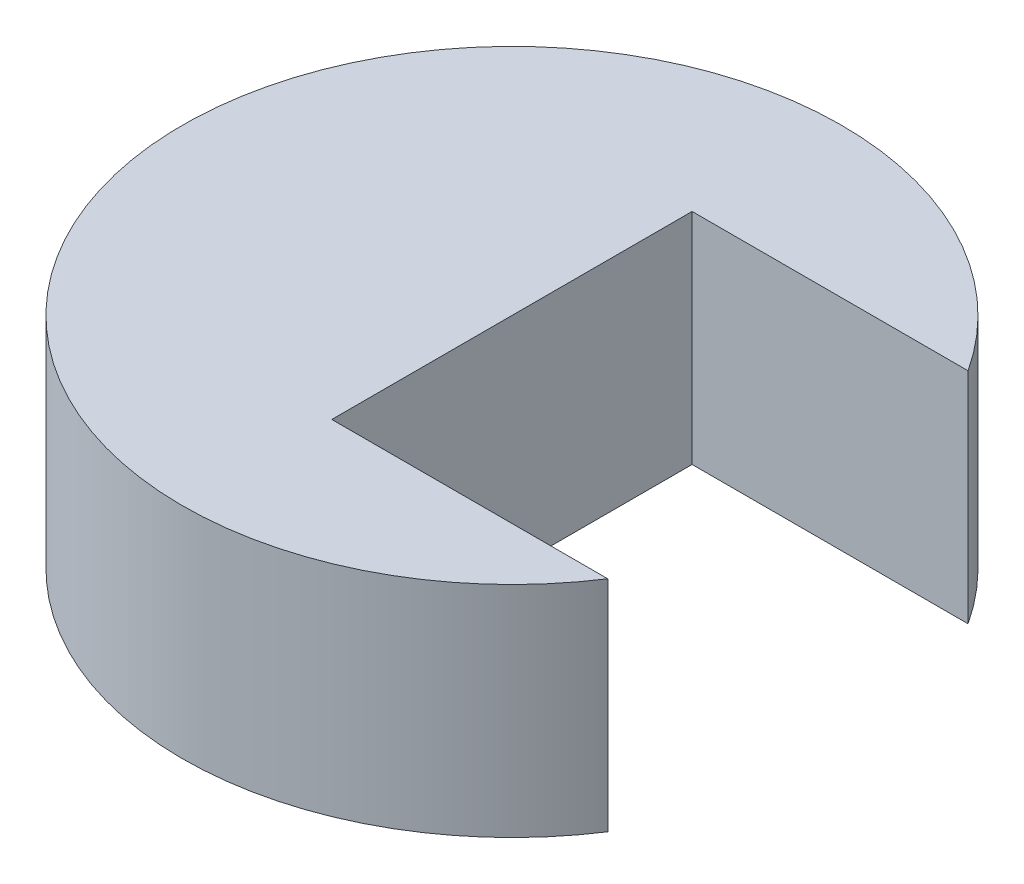
ISO-10303-21;
HEADER;
FILE_DESCRIPTION(('STEP AP214'),'2;1');
FILE_NAME('part.step','',(''),(''),'','','');
FILE_SCHEMA(('AUTOMOTIVE_DESIGN { 1 0 10303 214 1 1 1 1 }'));
ENDSEC;
DATA;
#1=APPLICATION_CONTEXT('core data for automotive mechanical design processes');
#2=APPLICATION_PROTOCOL_DEFINITION('international standard','automotive_design',2000,#1);
#3=PRODUCT_CONTEXT('',#1,'mechanical');
#4=PRODUCT('Part','Part','',(#3));
#5=PRODUCT_RELATED_PRODUCT_CATEGORY('part','',(#4));
#6=PRODUCT_DEFINITION_FORMATION('','',#4);
#7=PRODUCT_DEFINITION_CONTEXT('part definition',#1,'design');
#8=PRODUCT_DEFINITION('design','',#6,#7);
#9=PRODUCT_DEFINITION_SHAPE('','',#8);
#10=(LENGTH_UNIT() NAMED_UNIT(*) SI_UNIT(.MILLI.,.METRE.));
#11=(NAMED_UNIT(*) PLANE_ANGLE_UNIT() SI_UNIT($,.RADIAN.));
#12=(NAMED_UNIT(*) SI_UNIT($,.STERADIAN.) SOLID_ANGLE_UNIT());
#13=UNCERTAINTY_MEASURE_WITH_UNIT(LENGTH_MEASURE(1.E-05),#10,'distance_accuracy_value','');
#14=(GEOMETRIC_REPRESENTATION_CONTEXT(3) GLOBAL_UNCERTAINTY_ASSIGNED_CONTEXT((#13)) GLOBAL_UNIT_ASSIGNED_CONTEXT((#10,
#11,#12)) REPRESENTATION_CONTEXT('',''));
#15=CARTESIAN_POINT('',(0.,0.,0.));
#16=DIRECTION('',(0.,0.,1.));
#17=DIRECTION('',(1.,0.,0.));
#18=AXIS2_PLACEMENT_3D('',#15,#16,#17);
#19=CARTESIAN_POINT('',(0.,20.,-32.8817054401106));
#20=DIRECTION('',(0.,0.,-1.));
#21=DIRECTION('',(-1.,0.,0.));
#22=AXIS2_PLACEMENT_3D('',#19,#20,#21);
#23=PLANE('',#22);
#24=DIRECTION('',(1.,0.,0.));
#25=VECTOR('',#24,1.);
#26=CARTESIAN_POINT('',(0.,0.,-32.8817054401106));
#27=LINE('',#26,#25);
#28=CARTESIAN_POINT('',(-21.0523114098269,0.,-32.8817054401106));
#29=VERTEX_POINT('',#28);
#30=CARTESIAN_POINT('',(4.13077381867271,0.,-32.8817054401106));
#31=VERTEX_POINT('',#30);
#32=EDGE_CURVE('E112',#29,#31,#27,.T.);
#33=ORIENTED_EDGE('',*,*,#32,.T.);
#34=DIRECTION('',(0.,-1.,0.));
#35=VECTOR('',#34,1.);
#36=CARTESIAN_POINT('',(4.13077381867271,20.,-32.8817054401106));
#37=LINE('',#36,#35);
#38=CARTESIAN_POINT('',(4.13077381867271,20.,-32.8817054401106));
#39=VERTEX_POINT('',#38);
#40=EDGE_CURVE('E11',#39,#31,#37,.T.);
#41=ORIENTED_EDGE('',*,*,#40,.F.);
#42=DIRECTION('',(1.,0.,0.));
#43=VECTOR('',#42,1.);
#44=CARTESIAN_POINT('',(0.,20.,-32.8817054401106));
#45=LINE('',#44,#43);
#46=CARTESIAN_POINT('',(-21.0523114098269,20.,-32.8817054401106));
#47=VERTEX_POINT('',#46);
#48=EDGE_CURVE('E93',#47,#39,#45,.T.);
#49=ORIENTED_EDGE('',*,*,#48,.F.);
#50=DIRECTION('',(0.,-1.,0.));
#51=VECTOR('',#50,1.);
#52=CARTESIAN_POINT('',(-21.0523114098269,20.,-32.8817054401106));
#53=LINE('',#52,#51);
#54=EDGE_CURVE('E108',#47,#29,#53,.T.);
#55=ORIENTED_EDGE('',*,*,#54,.T.);
#56=EDGE_LOOP('',(#33,#41,#49,#55));
#57=FACE_BOUND('',#56,.T.);
#58=ADVANCED_FACE('F45',(#57),#23,.F.);
#59=CARTESIAN_POINT('',(-21.0523114098269,20.,-16.4408527200553));
#60=DIRECTION('',(0.,-1.,0.));
#61=DIRECTION('',(0.,0.,-1.));
#62=AXIS2_PLACEMENT_3D('',#59,#60,#61);
#63=CYLINDRICAL_SURFACE('',#62,30.074730585467);
#64=CARTESIAN_POINT('',(-21.0523114098269,0.,-16.4408527200553));
#65=DIRECTION('',(0.,1.,0.));
#66=DIRECTION('',(0.,0.,1.));
#67=AXIS2_PLACEMENT_3D('',#64,#65,#66);
#68=CIRCLE('',#67,30.074730585467);
#69=CARTESIAN_POINT('',(4.13077381867271,0.,0.));
#70=VERTEX_POINT('',#69);
#71=EDGE_CURVE('E99',#31,#70,#68,.T.);
#72=ORIENTED_EDGE('',*,*,#71,.T.);
#73=DIRECTION('',(0.,-1.,0.));
#74=VECTOR('',#73,1.);
#75=CARTESIAN_POINT('',(4.13077381867271,20.,0.));
#76=LINE('',#75,#74);
#77=CARTESIAN_POINT('',(4.13077381867271,20.,0.));
#78=VERTEX_POINT('',#77);
#79=EDGE_CURVE('E54',#78,#70,#76,.T.);
#80=ORIENTED_EDGE('',*,*,#79,.F.);
#81=CARTESIAN_POINT('',(-21.0523114098269,20.,-16.4408527200553));
#82=DIRECTION('',(0.,1.,0.));
#83=DIRECTION('',(0.,0.,1.));
#84=AXIS2_PLACEMENT_3D('',#81,#82,#83);
#85=CIRCLE('',#84,30.074730585467);
#86=EDGE_CURVE('E88',#39,#78,#85,.T.);
#87=ORIENTED_EDGE('',*,*,#86,.F.);
#88=ORIENTED_EDGE('',*,*,#40,.T.);
#89=EDGE_LOOP('',(#72,#80,#87,#88));
#90=FACE_BOUND('',#89,.T.);
#91=ADVANCED_FACE('F98',(#90),#63,.T.);
#92=CARTESIAN_POINT('',(0.,20.,0.));
#93=DIRECTION('',(0.,0.,-1.));
#94=DIRECTION('',(-1.,0.,0.));
#95=AXIS2_PLACEMENT_3D('',#92,#93,#94);
#96=PLANE('',#95);
#97=DIRECTION('',(1.,0.,0.));
#98=VECTOR('',#97,1.);
#99=CARTESIAN_POINT('',(0.,0.,0.));
#100=LINE('',#99,#98);
#101=CARTESIAN_POINT('',(-21.0523114098269,0.,0.));
#102=VERTEX_POINT('',#101);
#103=EDGE_CURVE('E118',#102,#70,#100,.T.);
#104=ORIENTED_EDGE('',*,*,#103,.F.);
#105=DIRECTION('',(0.,-1.,0.));
#106=VECTOR('',#105,1.);
#107=CARTESIAN_POINT('',(-21.0523114098269,20.,0.));
#108=LINE('',#107,#106);
#109=CARTESIAN_POINT('',(-21.0523114098269,20.,0.));
#110=VERTEX_POINT('',#109);
#111=EDGE_CURVE('E78',#110,#102,#108,.T.);
#112=ORIENTED_EDGE('',*,*,#111,.F.);
#113=DIRECTION('',(1.,0.,0.));
#114=VECTOR('',#113,1.);
#115=CARTESIAN_POINT('',(0.,20.,0.));
#116=LINE('',#115,#114);
#117=EDGE_CURVE('E91',#110,#78,#116,.T.);
#118=ORIENTED_EDGE('',*,*,#117,.T.);
#119=ORIENTED_EDGE('',*,*,#79,.T.);
#120=EDGE_LOOP('',(#104,#112,#118,#119));
#121=FACE_BOUND('',#120,.T.);
#122=ADVANCED_FACE('F104',(#121),#96,.T.);
#123=CARTESIAN_POINT('',(-21.0523114098269,20.,0.));
#124=DIRECTION('',(-1.,0.,0.));
#125=DIRECTION('',(0.,0.,1.));
#126=AXIS2_PLACEMENT_3D('',#123,#124,#125);
#127=PLANE('',#126);
#128=DIRECTION('',(0.,0.,-1.));
#129=VECTOR('',#128,1.);
#130=CARTESIAN_POINT('',(-21.0523114098269,0.,0.));
#131=LINE('',#130,#129);
#132=EDGE_CURVE('E81',#102,#29,#131,.T.);
#133=ORIENTED_EDGE('',*,*,#132,.T.);
#134=ORIENTED_EDGE('',*,*,#54,.F.);
#135=DIRECTION('',(0.,0.,-1.));
#136=VECTOR('',#135,1.);
#137=CARTESIAN_POINT('',(-21.0523114098269,20.,0.));
#138=LINE('',#137,#136);
#139=EDGE_CURVE('E62',#110,#47,#138,.T.);
#140=ORIENTED_EDGE('',*,*,#139,.F.);
#141=ORIENTED_EDGE('',*,*,#111,.T.);
#142=EDGE_LOOP('',(#133,#134,#140,#141));
#143=FACE_BOUND('',#142,.T.);
#144=ADVANCED_FACE('F135',(#143),#127,.F.);
#145=CARTESIAN_POINT('',(0.,20.,0.));
#146=DIRECTION('',(0.,1.,0.));
#147=DIRECTION('',(0.,0.,1.));
#148=AXIS2_PLACEMENT_3D('',#145,#146,#147);
#149=PLANE('',#148);
#150=ORIENTED_EDGE('',*,*,#48,.T.);
#151=ORIENTED_EDGE('',*,*,#86,.T.);
#152=ORIENTED_EDGE('',*,*,#117,.F.);
#153=ORIENTED_EDGE('',*,*,#139,.T.);
#154=EDGE_LOOP('',(#150,#151,#152,#153));
#155=FACE_BOUND('',#154,.T.);
#156=ADVANCED_FACE('F89',(#155),#149,.T.);
#157=CARTESIAN_POINT('',(0.,0.,0.));
#158=DIRECTION('',(0.,1.,0.));
#159=DIRECTION('',(0.,0.,1.));
#160=AXIS2_PLACEMENT_3D('',#157,#158,#159);
#161=PLANE('',#160);
#162=ORIENTED_EDGE('',*,*,#32,.F.);
#163=ORIENTED_EDGE('',*,*,#132,.F.);
#164=ORIENTED_EDGE('',*,*,#103,.T.);
#165=ORIENTED_EDGE('',*,*,#71,.F.);
#166=EDGE_LOOP('',(#162,#163,#164,#165));
#167=FACE_BOUND('',#166,.T.);
#168=ADVANCED_FACE('F129',(#167),#161,.F.);
#169=CLOSED_SHELL('',(#58,#91,#122,#144,#156,#168));
#170=MANIFOLD_SOLID_BREP('B2',#169);
#171=ADVANCED_BREP_SHAPE_REPRESENTATION('',(#18,#170),#14);
#172=SHAPE_DEFINITION_REPRESENTATION(#9,#171);
ENDSEC;
END-ISO-10303-21;
